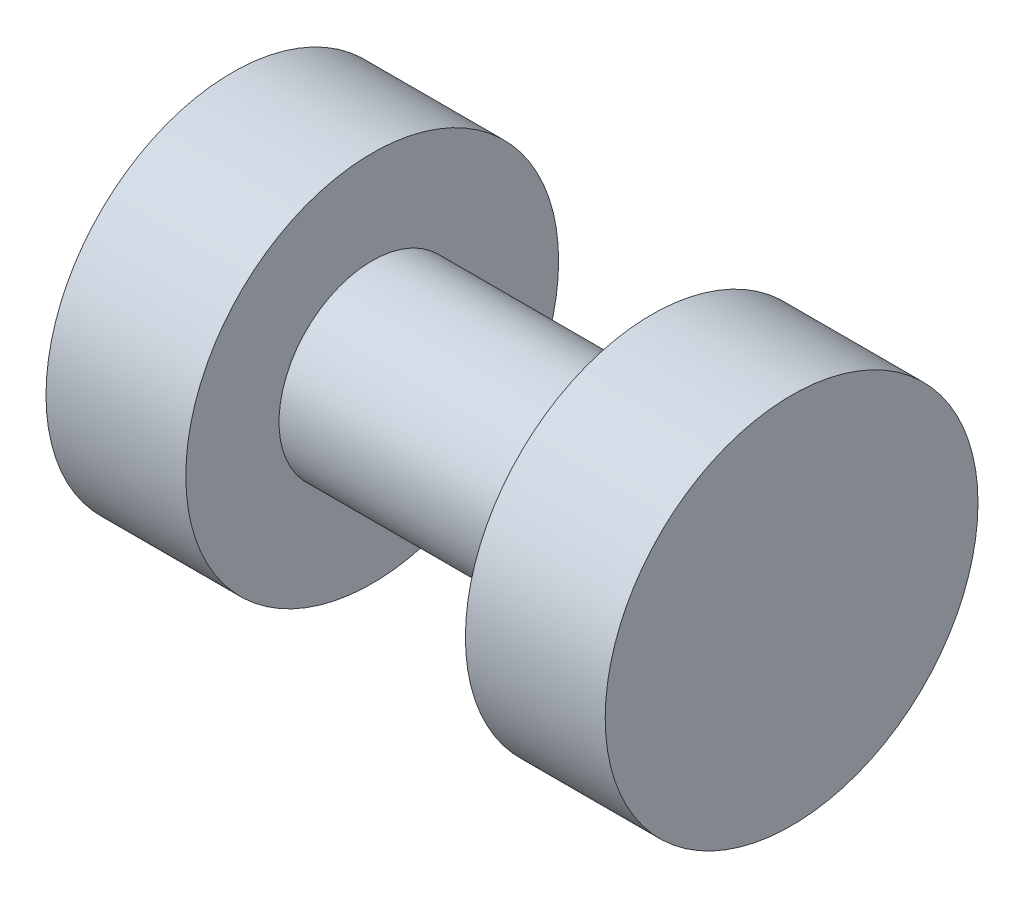
ISO-10303-21;
HEADER;
FILE_DESCRIPTION(('STEP AP214'),'2;1');
FILE_NAME('part.step','',(''),(''),'','','');
FILE_SCHEMA(('AUTOMOTIVE_DESIGN { 1 0 10303 214 1 1 1 1 }'));
ENDSEC;
DATA;
#1=APPLICATION_CONTEXT('core data for automotive mechanical design processes');
#2=APPLICATION_PROTOCOL_DEFINITION('international standard','automotive_design',2000,#1);
#3=PRODUCT_CONTEXT('',#1,'mechanical');
#4=PRODUCT('Part','Part','',(#3));
#5=PRODUCT_RELATED_PRODUCT_CATEGORY('part','',(#4));
#6=PRODUCT_DEFINITION_FORMATION('','',#4);
#7=PRODUCT_DEFINITION_CONTEXT('part definition',#1,'design');
#8=PRODUCT_DEFINITION('design','',#6,#7);
#9=PRODUCT_DEFINITION_SHAPE('','',#8);
#10=(LENGTH_UNIT() NAMED_UNIT(*) SI_UNIT(.MILLI.,.METRE.));
#11=(NAMED_UNIT(*) PLANE_ANGLE_UNIT() SI_UNIT($,.RADIAN.));
#12=(NAMED_UNIT(*) SI_UNIT($,.STERADIAN.) SOLID_ANGLE_UNIT());
#13=UNCERTAINTY_MEASURE_WITH_UNIT(LENGTH_MEASURE(1.E-05),#10,'distance_accuracy_value','');
#14=(GEOMETRIC_REPRESENTATION_CONTEXT(3) GLOBAL_UNCERTAINTY_ASSIGNED_CONTEXT((#13)) GLOBAL_UNIT_ASSIGNED_CONTEXT((#10,
#11,#12)) REPRESENTATION_CONTEXT('',''));
#15=CARTESIAN_POINT('',(0.,0.,0.));
#16=DIRECTION('',(0.,0.,1.));
#17=DIRECTION('',(1.,0.,0.));
#18=AXIS2_PLACEMENT_3D('',#15,#16,#17);
#19=CARTESIAN_POINT('',(0.,0.,0.));
#20=DIRECTION('',(-1.,0.,0.));
#21=DIRECTION('',(0.,0.,1.));
#22=AXIS2_PLACEMENT_3D('',#19,#20,#21);
#23=PLANE('',#22);
#24=CARTESIAN_POINT('',(0.,0.,0.));
#25=DIRECTION('',(1.,0.,0.));
#26=DIRECTION('',(0.,0.,-1.));
#27=AXIS2_PLACEMENT_3D('',#24,#25,#26);
#28=CIRCLE('',#27,10.);
#29=CARTESIAN_POINT('',(0.,0.,-10.));
#30=VERTEX_POINT('',#29);
#31=EDGE_CURVE('E10',#30,#30,#28,.T.);
#32=ORIENTED_EDGE('',*,*,#31,.F.);
#33=EDGE_LOOP('',(#32));
#34=FACE_BOUND('',#33,.T.);
#35=ADVANCED_FACE('F31',(#34),#23,.T.);
#36=CARTESIAN_POINT('',(30.,0.,0.));
#37=DIRECTION('',(1.,0.,0.));
#38=DIRECTION('',(0.,0.,-1.));
#39=AXIS2_PLACEMENT_3D('',#36,#37,#38);
#40=CYLINDRICAL_SURFACE('',#39,10.);
#41=ORIENTED_EDGE('',*,*,#31,.T.);
#42=EDGE_LOOP('',(#41));
#43=FACE_BOUND('',#42,.T.);
#44=CARTESIAN_POINT('',(7.5,0.,0.));
#45=DIRECTION('',(1.,0.,0.));
#46=DIRECTION('',(0.,0.,-1.));
#47=AXIS2_PLACEMENT_3D('',#44,#45,#46);
#48=CIRCLE('',#47,10.);
#49=CARTESIAN_POINT('',(7.5,0.,-10.));
#50=VERTEX_POINT('',#49);
#51=EDGE_CURVE('E37',#50,#50,#48,.T.);
#52=ORIENTED_EDGE('',*,*,#51,.F.);
#53=EDGE_LOOP('',(#52));
#54=FACE_BOUND('',#53,.T.);
#55=ADVANCED_FACE('F73',(#43,#54),#40,.T.);
#56=CARTESIAN_POINT('',(7.5,10.,0.));
#57=DIRECTION('',(1.,0.,0.));
#58=DIRECTION('',(0.,0.,-1.));
#59=AXIS2_PLACEMENT_3D('',#56,#57,#58);
#60=PLANE('',#59);
#61=ORIENTED_EDGE('',*,*,#51,.T.);
#62=EDGE_LOOP('',(#61));
#63=FACE_BOUND('',#62,.T.);
#64=CARTESIAN_POINT('',(7.5,0.,0.));
#65=DIRECTION('',(1.,0.,0.));
#66=DIRECTION('',(0.,0.,-1.));
#67=AXIS2_PLACEMENT_3D('',#64,#65,#66);
#68=CIRCLE('',#67,5.);
#69=CARTESIAN_POINT('',(7.5,0.,-5.));
#70=VERTEX_POINT('',#69);
#71=EDGE_CURVE('E41',#70,#70,#68,.T.);
#72=ORIENTED_EDGE('',*,*,#71,.F.);
#73=EDGE_LOOP('',(#72));
#74=FACE_BOUND('',#73,.T.);
#75=ADVANCED_FACE('F78',(#63,#74),#60,.T.);
#76=CARTESIAN_POINT('',(30.,0.,0.));
#77=DIRECTION('',(1.,0.,0.));
#78=DIRECTION('',(0.,0.,-1.));
#79=AXIS2_PLACEMENT_3D('',#76,#77,#78);
#80=CYLINDRICAL_SURFACE('',#79,5.);
#81=ORIENTED_EDGE('',*,*,#71,.T.);
#82=EDGE_LOOP('',(#81));
#83=FACE_BOUND('',#82,.T.);
#84=CARTESIAN_POINT('',(22.5,0.,0.));
#85=DIRECTION('',(1.,0.,0.));
#86=DIRECTION('',(0.,0.,-1.));
#87=AXIS2_PLACEMENT_3D('',#84,#85,#86);
#88=CIRCLE('',#87,5.);
#89=CARTESIAN_POINT('',(22.5,0.,-5.));
#90=VERTEX_POINT('',#89);
#91=EDGE_CURVE('E45',#90,#90,#88,.T.);
#92=ORIENTED_EDGE('',*,*,#91,.F.);
#93=EDGE_LOOP('',(#92));
#94=FACE_BOUND('',#93,.T.);
#95=ADVANCED_FACE('F69',(#83,#94),#80,.T.);
#96=CARTESIAN_POINT('',(22.5,5.,0.));
#97=DIRECTION('',(-1.,0.,0.));
#98=DIRECTION('',(0.,0.,1.));
#99=AXIS2_PLACEMENT_3D('',#96,#97,#98);
#100=PLANE('',#99);
#101=ORIENTED_EDGE('',*,*,#91,.T.);
#102=EDGE_LOOP('',(#101));
#103=FACE_BOUND('',#102,.T.);
#104=CARTESIAN_POINT('',(22.5,0.,0.));
#105=DIRECTION('',(1.,0.,0.));
#106=DIRECTION('',(0.,0.,-1.));
#107=AXIS2_PLACEMENT_3D('',#104,#105,#106);
#108=CIRCLE('',#107,10.);
#109=CARTESIAN_POINT('',(22.5,0.,-10.));
#110=VERTEX_POINT('',#109);
#111=EDGE_CURVE('E50',#110,#110,#108,.T.);
#112=ORIENTED_EDGE('',*,*,#111,.F.);
#113=EDGE_LOOP('',(#112));
#114=FACE_BOUND('',#113,.T.);
#115=ADVANCED_FACE('F61',(#103,#114),#100,.T.);
#116=CARTESIAN_POINT('',(30.,0.,0.));
#117=DIRECTION('',(1.,0.,0.));
#118=DIRECTION('',(0.,0.,-1.));
#119=AXIS2_PLACEMENT_3D('',#116,#117,#118);
#120=CYLINDRICAL_SURFACE('',#119,10.);
#121=ORIENTED_EDGE('',*,*,#111,.T.);
#122=EDGE_LOOP('',(#121));
#123=FACE_BOUND('',#122,.T.);
#124=CARTESIAN_POINT('',(30.,0.,0.));
#125=DIRECTION('',(1.,0.,0.));
#126=DIRECTION('',(0.,0.,-1.));
#127=AXIS2_PLACEMENT_3D('',#124,#125,#126);
#128=CIRCLE('',#127,10.);
#129=CARTESIAN_POINT('',(30.,0.,-10.));
#130=VERTEX_POINT('',#129);
#131=EDGE_CURVE('E53',#130,#130,#128,.T.);
#132=ORIENTED_EDGE('',*,*,#131,.F.);
#133=EDGE_LOOP('',(#132));
#134=FACE_BOUND('',#133,.T.);
#135=ADVANCED_FACE('F59',(#123,#134),#120,.T.);
#136=CARTESIAN_POINT('',(30.,10.,0.));
#137=DIRECTION('',(1.,0.,0.));
#138=DIRECTION('',(0.,0.,-1.));
#139=AXIS2_PLACEMENT_3D('',#136,#137,#138);
#140=PLANE('',#139);
#141=ORIENTED_EDGE('',*,*,#131,.T.);
#142=EDGE_LOOP('',(#141));
#143=FACE_BOUND('',#142,.T.);
#144=ADVANCED_FACE('F57',(#143),#140,.T.);
#145=CLOSED_SHELL('',(#35,#55,#75,#95,#115,#135,#144));
#146=MANIFOLD_SOLID_BREP('B2',#145);
#147=ADVANCED_BREP_SHAPE_REPRESENTATION('',(#18,#146),#14);
#148=SHAPE_DEFINITION_REPRESENTATION(#9,#147);
ENDSEC;
END-ISO-10303-21;
